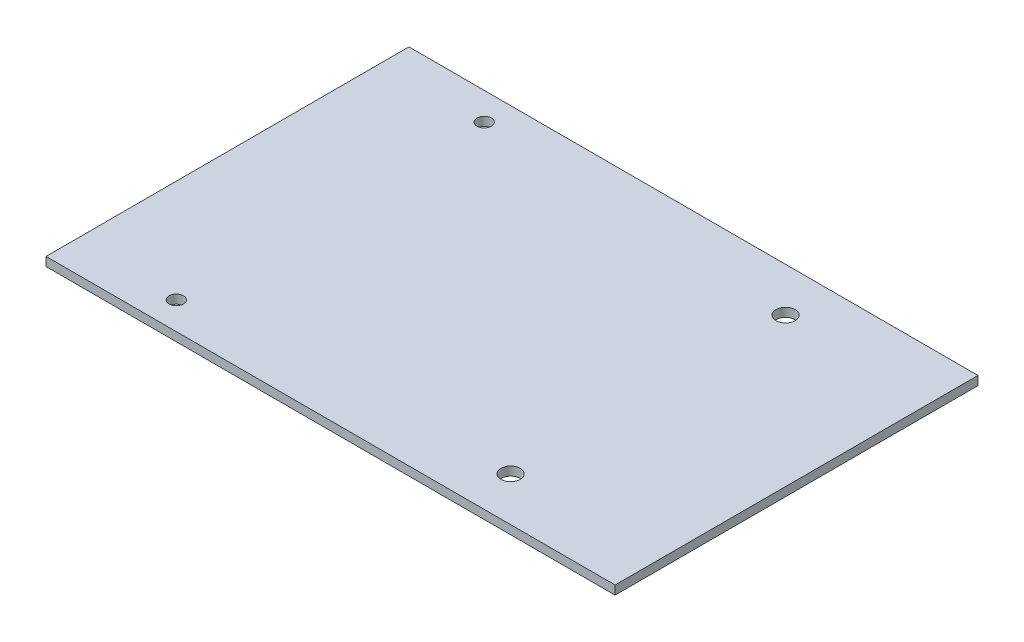
ISO-10303-21;
HEADER;
FILE_DESCRIPTION(('STEP AP214'),'2;1');
FILE_NAME('part.step','',(''),(''),'','','');
FILE_SCHEMA(('AUTOMOTIVE_DESIGN { 1 0 10303 214 1 1 1 1 }'));
ENDSEC;
DATA;
#1=APPLICATION_CONTEXT('core data for automotive mechanical design processes');
#2=APPLICATION_PROTOCOL_DEFINITION('international standard','automotive_design',2000,#1);
#3=PRODUCT_CONTEXT('',#1,'mechanical');
#4=PRODUCT('Part','Part','',(#3));
#5=PRODUCT_RELATED_PRODUCT_CATEGORY('part','',(#4));
#6=PRODUCT_DEFINITION_FORMATION('','',#4);
#7=PRODUCT_DEFINITION_CONTEXT('part definition',#1,'design');
#8=PRODUCT_DEFINITION('design','',#6,#7);
#9=PRODUCT_DEFINITION_SHAPE('','',#8);
#10=(LENGTH_UNIT() NAMED_UNIT(*) SI_UNIT(.MILLI.,.METRE.));
#11=(NAMED_UNIT(*) PLANE_ANGLE_UNIT() SI_UNIT($,.RADIAN.));
#12=(NAMED_UNIT(*) SI_UNIT($,.STERADIAN.) SOLID_ANGLE_UNIT());
#13=UNCERTAINTY_MEASURE_WITH_UNIT(LENGTH_MEASURE(1.E-05),#10,'distance_accuracy_value','');
#14=(GEOMETRIC_REPRESENTATION_CONTEXT(3) GLOBAL_UNCERTAINTY_ASSIGNED_CONTEXT((#13)) GLOBAL_UNIT_ASSIGNED_CONTEXT((#10,
#11,#12)) REPRESENTATION_CONTEXT('',''));
#15=CARTESIAN_POINT('',(0.,0.,0.));
#16=DIRECTION('',(0.,0.,1.));
#17=DIRECTION('',(1.,0.,0.));
#18=AXIS2_PLACEMENT_3D('',#15,#16,#17);
#19=CARTESIAN_POINT('',(51.75,1.6,33.));
#20=DIRECTION('',(-1.,0.,0.));
#21=DIRECTION('',(0.,0.,1.));
#22=AXIS2_PLACEMENT_3D('',#19,#20,#21);
#23=PLANE('',#22);
#24=DIRECTION('',(0.,0.,-1.));
#25=VECTOR('',#24,1.);
#26=CARTESIAN_POINT('',(51.75,0.,33.));
#27=LINE('',#26,#25);
#28=CARTESIAN_POINT('',(51.75,0.,33.));
#29=VERTEX_POINT('',#28);
#30=CARTESIAN_POINT('',(51.75,0.,-33.));
#31=VERTEX_POINT('',#30);
#32=EDGE_CURVE('E96',#29,#31,#27,.T.);
#33=ORIENTED_EDGE('',*,*,#32,.T.);
#34=DIRECTION('',(0.,-1.,0.));
#35=VECTOR('',#34,1.);
#36=CARTESIAN_POINT('',(51.75,1.6,-33.));
#37=LINE('',#36,#35);
#38=CARTESIAN_POINT('',(51.75,1.6,-33.));
#39=VERTEX_POINT('',#38);
#40=EDGE_CURVE('E11',#39,#31,#37,.T.);
#41=ORIENTED_EDGE('',*,*,#40,.F.);
#42=DIRECTION('',(0.,0.,-1.));
#43=VECTOR('',#42,1.);
#44=CARTESIAN_POINT('',(51.75,1.6,33.));
#45=LINE('',#44,#43);
#46=CARTESIAN_POINT('',(51.75,1.6,33.));
#47=VERTEX_POINT('',#46);
#48=EDGE_CURVE('E83',#47,#39,#45,.T.);
#49=ORIENTED_EDGE('',*,*,#48,.F.);
#50=DIRECTION('',(0.,-1.,0.));
#51=VECTOR('',#50,1.);
#52=CARTESIAN_POINT('',(51.75,1.6,33.));
#53=LINE('',#52,#51);
#54=EDGE_CURVE('E92',#47,#29,#53,.T.);
#55=ORIENTED_EDGE('',*,*,#54,.T.);
#56=EDGE_LOOP('',(#33,#41,#49,#55));
#57=FACE_BOUND('',#56,.T.);
#58=ADVANCED_FACE('F30',(#57),#23,.F.);
#59=CARTESIAN_POINT('',(-51.75,1.6,-33.));
#60=DIRECTION('',(0.,0.,1.));
#61=DIRECTION('',(1.,0.,0.));
#62=AXIS2_PLACEMENT_3D('',#59,#60,#61);
#63=PLANE('',#62);
#64=DIRECTION('',(-1.,0.,0.));
#65=VECTOR('',#64,1.);
#66=CARTESIAN_POINT('',(-51.75,0.,-33.));
#67=LINE('',#66,#65);
#68=CARTESIAN_POINT('',(-51.75,0.,-33.));
#69=VERTEX_POINT('',#68);
#70=EDGE_CURVE('E87',#31,#69,#67,.T.);
#71=ORIENTED_EDGE('',*,*,#70,.T.);
#72=DIRECTION('',(0.,-1.,0.));
#73=VECTOR('',#72,1.);
#74=CARTESIAN_POINT('',(-51.75,1.6,-33.));
#75=LINE('',#74,#73);
#76=CARTESIAN_POINT('',(-51.75,1.6,-33.));
#77=VERTEX_POINT('',#76);
#78=EDGE_CURVE('E39',#77,#69,#75,.T.);
#79=ORIENTED_EDGE('',*,*,#78,.F.);
#80=DIRECTION('',(-1.,0.,0.));
#81=VECTOR('',#80,1.);
#82=CARTESIAN_POINT('',(-51.75,1.6,-33.));
#83=LINE('',#82,#81);
#84=EDGE_CURVE('E78',#39,#77,#83,.T.);
#85=ORIENTED_EDGE('',*,*,#84,.F.);
#86=ORIENTED_EDGE('',*,*,#40,.T.);
#87=EDGE_LOOP('',(#71,#79,#85,#86));
#88=FACE_BOUND('',#87,.T.);
#89=ADVANCED_FACE('F86',(#88),#63,.F.);
#90=CARTESIAN_POINT('',(-51.75,1.6,33.));
#91=DIRECTION('',(1.,0.,0.));
#92=DIRECTION('',(0.,0.,-1.));
#93=AXIS2_PLACEMENT_3D('',#90,#91,#92);
#94=PLANE('',#93);
#95=DIRECTION('',(0.,0.,1.));
#96=VECTOR('',#95,1.);
#97=CARTESIAN_POINT('',(-51.75,0.,33.));
#98=LINE('',#97,#96);
#99=CARTESIAN_POINT('',(-51.75,0.,33.));
#100=VERTEX_POINT('',#99);
#101=EDGE_CURVE('E65',#69,#100,#98,.T.);
#102=ORIENTED_EDGE('',*,*,#101,.T.);
#103=DIRECTION('',(0.,-1.,0.));
#104=VECTOR('',#103,1.);
#105=CARTESIAN_POINT('',(-51.75,1.6,33.));
#106=LINE('',#105,#104);
#107=CARTESIAN_POINT('',(-51.75,1.6,33.));
#108=VERTEX_POINT('',#107);
#109=EDGE_CURVE('E88',#108,#100,#106,.T.);
#110=ORIENTED_EDGE('',*,*,#109,.F.);
#111=DIRECTION('',(0.,0.,1.));
#112=VECTOR('',#111,1.);
#113=CARTESIAN_POINT('',(-51.75,1.6,33.));
#114=LINE('',#113,#112);
#115=EDGE_CURVE('E81',#77,#108,#114,.T.);
#116=ORIENTED_EDGE('',*,*,#115,.F.);
#117=ORIENTED_EDGE('',*,*,#78,.T.);
#118=EDGE_LOOP('',(#102,#110,#116,#117));
#119=FACE_BOUND('',#118,.T.);
#120=ADVANCED_FACE('F90',(#119),#94,.F.);
#121=CARTESIAN_POINT('',(-51.75,1.6,33.));
#122=DIRECTION('',(0.,0.,-1.));
#123=DIRECTION('',(-1.,0.,0.));
#124=AXIS2_PLACEMENT_3D('',#121,#122,#123);
#125=PLANE('',#124);
#126=DIRECTION('',(1.,0.,0.));
#127=VECTOR('',#126,1.);
#128=CARTESIAN_POINT('',(-51.75,0.,33.));
#129=LINE('',#128,#127);
#130=EDGE_CURVE('E71',#100,#29,#129,.T.);
#131=ORIENTED_EDGE('',*,*,#130,.T.);
#132=ORIENTED_EDGE('',*,*,#54,.F.);
#133=DIRECTION('',(1.,0.,0.));
#134=VECTOR('',#133,1.);
#135=CARTESIAN_POINT('',(-51.75,1.6,33.));
#136=LINE('',#135,#134);
#137=EDGE_CURVE('E48',#108,#47,#136,.T.);
#138=ORIENTED_EDGE('',*,*,#137,.F.);
#139=ORIENTED_EDGE('',*,*,#109,.T.);
#140=EDGE_LOOP('',(#131,#132,#138,#139));
#141=FACE_BOUND('',#140,.T.);
#142=ADVANCED_FACE('F135',(#141),#125,.F.);
#143=CARTESIAN_POINT('',(51.75,1.6,-33.));
#144=DIRECTION('',(0.,-1.,0.));
#145=DIRECTION('',(0.,0.,-1.));
#146=AXIS2_PLACEMENT_3D('',#143,#144,#145);
#147=PLANE('',#146);
#148=CARTESIAN_POINT('',(24.75,1.6,25.));
#149=DIRECTION('',(0.,1.,0.));
#150=DIRECTION('',(0.,0.,1.));
#151=AXIS2_PLACEMENT_3D('',#148,#149,#150);
#152=CIRCLE('',#151,1.75);
#153=CARTESIAN_POINT('',(24.75,1.6,26.75));
#154=VERTEX_POINT('',#153);
#155=EDGE_CURVE('E121',#154,#154,#152,.T.);
#156=ORIENTED_EDGE('',*,*,#155,.F.);
#157=EDGE_LOOP('',(#156));
#158=FACE_BOUND('',#157,.T.);
#159=CARTESIAN_POINT('',(24.75,1.6,-25.));
#160=DIRECTION('',(0.,1.,0.));
#161=DIRECTION('',(0.,0.,1.));
#162=AXIS2_PLACEMENT_3D('',#159,#160,#161);
#163=CIRCLE('',#162,1.75);
#164=CARTESIAN_POINT('',(24.75,1.6,-23.25));
#165=VERTEX_POINT('',#164);
#166=EDGE_CURVE('E117',#165,#165,#163,.T.);
#167=ORIENTED_EDGE('',*,*,#166,.F.);
#168=EDGE_LOOP('',(#167));
#169=FACE_BOUND('',#168,.T.);
#170=CARTESIAN_POINT('',(-33.052335,1.6,28.));
#171=DIRECTION('',(0.,1.,0.));
#172=DIRECTION('',(0.,0.,1.));
#173=AXIS2_PLACEMENT_3D('',#170,#171,#172);
#174=CIRCLE('',#173,1.3);
#175=CARTESIAN_POINT('',(-33.052335,1.6,29.3));
#176=VERTEX_POINT('',#175);
#177=EDGE_CURVE('E113',#176,#176,#174,.T.);
#178=ORIENTED_EDGE('',*,*,#177,.F.);
#179=EDGE_LOOP('',(#178));
#180=FACE_BOUND('',#179,.T.);
#181=CARTESIAN_POINT('',(-33.052335,1.6,-28.));
#182=DIRECTION('',(0.,1.,0.));
#183=DIRECTION('',(0.,0.,1.));
#184=AXIS2_PLACEMENT_3D('',#181,#182,#183);
#185=CIRCLE('',#184,1.3);
#186=CARTESIAN_POINT('',(-33.052335,1.6,-26.7));
#187=VERTEX_POINT('',#186);
#188=EDGE_CURVE('E105',#187,#187,#185,.T.);
#189=ORIENTED_EDGE('',*,*,#188,.F.);
#190=EDGE_LOOP('',(#189));
#191=FACE_BOUND('',#190,.T.);
#192=ORIENTED_EDGE('',*,*,#48,.T.);
#193=ORIENTED_EDGE('',*,*,#84,.T.);
#194=ORIENTED_EDGE('',*,*,#115,.T.);
#195=ORIENTED_EDGE('',*,*,#137,.T.);
#196=EDGE_LOOP('',(#192,#193,#194,#195));
#197=FACE_BOUND('',#196,.T.);
#198=ADVANCED_FACE('F79',(#158,#169,#180,#191,#197),#147,.F.);
#199=CARTESIAN_POINT('',(51.75,0.,-33.));
#200=DIRECTION('',(0.,-1.,0.));
#201=DIRECTION('',(0.,0.,-1.));
#202=AXIS2_PLACEMENT_3D('',#199,#200,#201);
#203=PLANE('',#202);
#204=CARTESIAN_POINT('',(24.75,0.,25.));
#205=DIRECTION('',(0.,-1.,0.));
#206=DIRECTION('',(0.,0.,-1.));
#207=AXIS2_PLACEMENT_3D('',#204,#205,#206);
#208=CIRCLE('',#207,1.75);
#209=CARTESIAN_POINT('',(24.75,0.,23.25));
#210=VERTEX_POINT('',#209);
#211=EDGE_CURVE('E124',#210,#210,#208,.F.);
#212=ORIENTED_EDGE('',*,*,#211,.T.);
#213=EDGE_LOOP('',(#212));
#214=FACE_BOUND('',#213,.T.);
#215=CARTESIAN_POINT('',(24.75,0.,-25.));
#216=DIRECTION('',(0.,-1.,0.));
#217=DIRECTION('',(0.,0.,-1.));
#218=AXIS2_PLACEMENT_3D('',#215,#216,#217);
#219=CIRCLE('',#218,1.75);
#220=CARTESIAN_POINT('',(24.75,0.,-26.75));
#221=VERTEX_POINT('',#220);
#222=EDGE_CURVE('E118',#221,#221,#219,.F.);
#223=ORIENTED_EDGE('',*,*,#222,.T.);
#224=EDGE_LOOP('',(#223));
#225=FACE_BOUND('',#224,.T.);
#226=CARTESIAN_POINT('',(-33.052335,0.,28.));
#227=DIRECTION('',(0.,-1.,0.));
#228=DIRECTION('',(0.,0.,-1.));
#229=AXIS2_PLACEMENT_3D('',#226,#227,#228);
#230=CIRCLE('',#229,1.3);
#231=CARTESIAN_POINT('',(-33.052335,0.,26.7));
#232=VERTEX_POINT('',#231);
#233=EDGE_CURVE('E33',#232,#232,#230,.T.);
#234=ORIENTED_EDGE('',*,*,#233,.F.);
#235=EDGE_LOOP('',(#234));
#236=FACE_BOUND('',#235,.T.);
#237=CARTESIAN_POINT('',(-33.052335,0.,-28.));
#238=DIRECTION('',(0.,-1.,0.));
#239=DIRECTION('',(0.,0.,-1.));
#240=AXIS2_PLACEMENT_3D('',#237,#238,#239);
#241=CIRCLE('',#240,1.3);
#242=CARTESIAN_POINT('',(-33.052335,0.,-29.3));
#243=VERTEX_POINT('',#242);
#244=EDGE_CURVE('E99',#243,#243,#241,.T.);
#245=ORIENTED_EDGE('',*,*,#244,.F.);
#246=EDGE_LOOP('',(#245));
#247=FACE_BOUND('',#246,.T.);
#248=ORIENTED_EDGE('',*,*,#32,.F.);
#249=ORIENTED_EDGE('',*,*,#130,.F.);
#250=ORIENTED_EDGE('',*,*,#101,.F.);
#251=ORIENTED_EDGE('',*,*,#70,.F.);
#252=EDGE_LOOP('',(#248,#249,#250,#251));
#253=FACE_BOUND('',#252,.T.);
#254=ADVANCED_FACE('F134',(#214,#225,#236,#247,#253),#203,.T.);
#255=CARTESIAN_POINT('',(-33.052335,-8.4,-28.));
#256=DIRECTION('',(0.,1.,0.));
#257=DIRECTION('',(0.,0.,1.));
#258=AXIS2_PLACEMENT_3D('',#255,#256,#257);
#259=CYLINDRICAL_SURFACE('',#258,1.3);
#260=ORIENTED_EDGE('',*,*,#244,.T.);
#261=EDGE_LOOP('',(#260));
#262=FACE_BOUND('',#261,.T.);
#263=ORIENTED_EDGE('',*,*,#188,.T.);
#264=EDGE_LOOP('',(#263));
#265=FACE_BOUND('',#264,.T.);
#266=ADVANCED_FACE('F145',(#262,#265),#259,.F.);
#267=CARTESIAN_POINT('',(-33.052335,-8.4,28.));
#268=DIRECTION('',(0.,1.,0.));
#269=DIRECTION('',(0.,0.,1.));
#270=AXIS2_PLACEMENT_3D('',#267,#268,#269);
#271=CYLINDRICAL_SURFACE('',#270,1.3);
#272=ORIENTED_EDGE('',*,*,#233,.T.);
#273=EDGE_LOOP('',(#272));
#274=FACE_BOUND('',#273,.T.);
#275=ORIENTED_EDGE('',*,*,#177,.T.);
#276=EDGE_LOOP('',(#275));
#277=FACE_BOUND('',#276,.T.);
#278=ADVANCED_FACE('F142',(#274,#277),#271,.F.);
#279=CARTESIAN_POINT('',(24.75,-0.000999999999999916,-25.));
#280=DIRECTION('',(0.,1.,0.));
#281=DIRECTION('',(0.,0.,1.));
#282=AXIS2_PLACEMENT_3D('',#279,#280,#281);
#283=CYLINDRICAL_SURFACE('',#282,1.75);
#284=ORIENTED_EDGE('',*,*,#222,.F.);
#285=EDGE_LOOP('',(#284));
#286=FACE_BOUND('',#285,.T.);
#287=ORIENTED_EDGE('',*,*,#166,.T.);
#288=EDGE_LOOP('',(#287));
#289=FACE_BOUND('',#288,.T.);
#290=ADVANCED_FACE('F144',(#286,#289),#283,.F.);
#291=CARTESIAN_POINT('',(24.75,-0.000999999999999916,25.));
#292=DIRECTION('',(0.,1.,0.));
#293=DIRECTION('',(0.,0.,1.));
#294=AXIS2_PLACEMENT_3D('',#291,#292,#293);
#295=CYLINDRICAL_SURFACE('',#294,1.75);
#296=ORIENTED_EDGE('',*,*,#211,.F.);
#297=EDGE_LOOP('',(#296));
#298=FACE_BOUND('',#297,.T.);
#299=ORIENTED_EDGE('',*,*,#155,.T.);
#300=EDGE_LOOP('',(#299));
#301=FACE_BOUND('',#300,.T.);
#302=ADVANCED_FACE('F130',(#298,#301),#295,.F.);
#303=CLOSED_SHELL('',(#58,#89,#120,#142,#198,#254,#266,#278,#290,#302));
#304=MANIFOLD_SOLID_BREP('B2',#303);
#305=ADVANCED_BREP_SHAPE_REPRESENTATION('',(#18,#304),#14);
#306=SHAPE_DEFINITION_REPRESENTATION(#9,#305);
ENDSEC;
END-ISO-10303-21;
